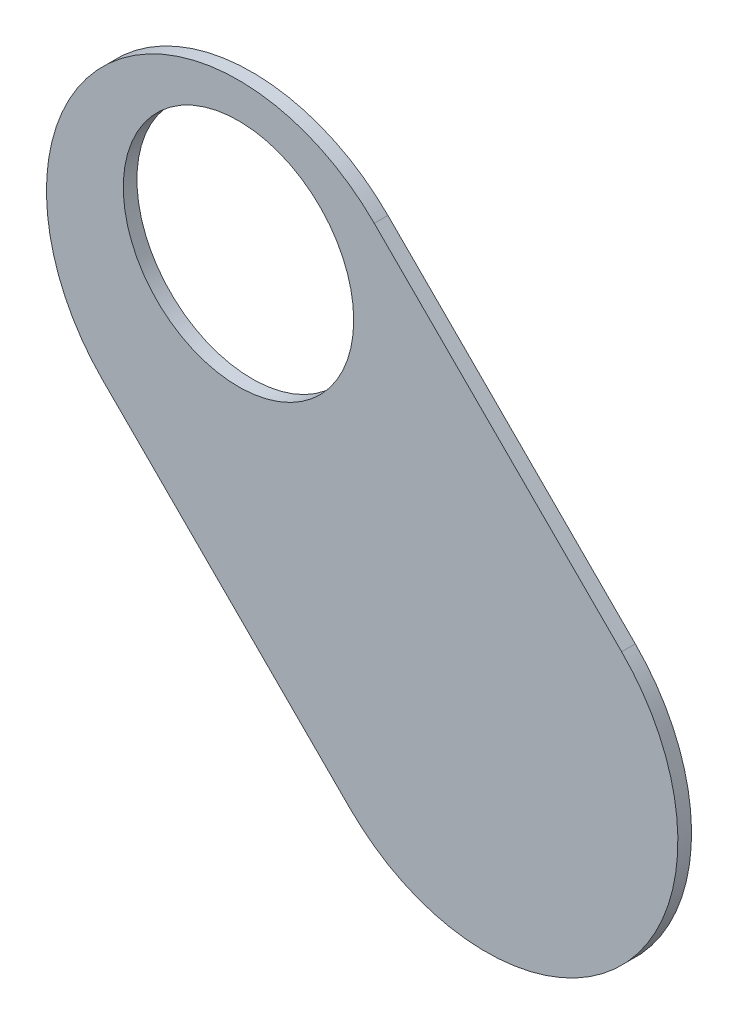
ISO-10303-21;
HEADER;
FILE_DESCRIPTION(('STEP AP214'),'2;1');
FILE_NAME('part.step','',(''),(''),'','','');
FILE_SCHEMA(('AUTOMOTIVE_DESIGN { 1 0 10303 214 1 1 1 1 }'));
ENDSEC;
DATA;
#1=APPLICATION_CONTEXT('core data for automotive mechanical design processes');
#2=APPLICATION_PROTOCOL_DEFINITION('international standard','automotive_design',2000,#1);
#3=PRODUCT_CONTEXT('',#1,'mechanical');
#4=PRODUCT('Part','Part','',(#3));
#5=PRODUCT_RELATED_PRODUCT_CATEGORY('part','',(#4));
#6=PRODUCT_DEFINITION_FORMATION('','',#4);
#7=PRODUCT_DEFINITION_CONTEXT('part definition',#1,'design');
#8=PRODUCT_DEFINITION('design','',#6,#7);
#9=PRODUCT_DEFINITION_SHAPE('','',#8);
#10=(LENGTH_UNIT() NAMED_UNIT(*) SI_UNIT(.MILLI.,.METRE.));
#11=(NAMED_UNIT(*) PLANE_ANGLE_UNIT() SI_UNIT($,.RADIAN.));
#12=(NAMED_UNIT(*) SI_UNIT($,.STERADIAN.) SOLID_ANGLE_UNIT());
#13=UNCERTAINTY_MEASURE_WITH_UNIT(LENGTH_MEASURE(1.E-05),#10,'distance_accuracy_value','');
#14=(GEOMETRIC_REPRESENTATION_CONTEXT(3) GLOBAL_UNCERTAINTY_ASSIGNED_CONTEXT((#13)) GLOBAL_UNIT_ASSIGNED_CONTEXT((#10,
#11,#12)) REPRESENTATION_CONTEXT('',''));
#15=CARTESIAN_POINT('',(0.,0.,0.));
#16=DIRECTION('',(0.,0.,1.));
#17=DIRECTION('',(1.,0.,0.));
#18=AXIS2_PLACEMENT_3D('',#15,#16,#17);
#19=CARTESIAN_POINT('',(80.50643284,95.53821888,0.));
#20=DIRECTION('',(0.707106781186548,0.707106781186548,0.));
#21=DIRECTION('',(0.707106781186548,-0.707106781186548,0.));
#22=AXIS2_PLACEMENT_3D('',#19,#20,#21);
#23=PLANE('',#22);
#24=DIRECTION('',(0.707106781186548,-0.707106781186548,0.));
#25=VECTOR('',#24,1.);
#26=CARTESIAN_POINT('',(80.50643284,95.53821888,0.03556));
#27=LINE('',#26,#25);
#28=CARTESIAN_POINT('',(80.50643284,95.53821888,0.03556));
#29=VERTEX_POINT('',#28);
#30=CARTESIAN_POINT('',(81.15046762,94.8941841,0.03556));
#31=VERTEX_POINT('',#30);
#32=EDGE_CURVE('E11',#29,#31,#27,.T.);
#33=ORIENTED_EDGE('',*,*,#32,.F.);
#34=DIRECTION('',(0.,0.,1.));
#35=VECTOR('',#34,1.);
#36=CARTESIAN_POINT('',(80.50643284,95.53821888,0.));
#37=LINE('',#36,#35);
#38=CARTESIAN_POINT('',(80.50643284,95.53821888,0.));
#39=VERTEX_POINT('',#38);
#40=EDGE_CURVE('E24',#39,#29,#37,.T.);
#41=ORIENTED_EDGE('',*,*,#40,.F.);
#42=DIRECTION('',(0.707106781186548,-0.707106781186548,0.));
#43=VECTOR('',#42,1.);
#44=CARTESIAN_POINT('',(80.50643284,95.53821888,0.));
#45=LINE('',#44,#43);
#46=CARTESIAN_POINT('',(81.15046762,94.8941841,0.));
#47=VERTEX_POINT('',#46);
#48=EDGE_CURVE('E96',#39,#47,#45,.T.);
#49=ORIENTED_EDGE('',*,*,#48,.T.);
#50=DIRECTION('',(0.,0.,1.));
#51=VECTOR('',#50,1.);
#52=CARTESIAN_POINT('',(81.15046762,94.8941841,0.));
#53=LINE('',#52,#51);
#54=EDGE_CURVE('E37',#47,#31,#53,.T.);
#55=ORIENTED_EDGE('',*,*,#54,.T.);
#56=EDGE_LOOP('',(#33,#41,#49,#55));
#57=FACE_BOUND('',#56,.T.);
#58=ADVANCED_FACE('F17',(#57),#23,.F.);
#59=CARTESIAN_POINT('',(80.8599856,95.89177164,0.));
#60=DIRECTION('',(0.,0.,-1.));
#61=DIRECTION('',(0.707106781186548,0.707106781186548,0.));
#62=AXIS2_PLACEMENT_3D('',#59,#60,#61);
#63=CYLINDRICAL_SURFACE('',#62,0.499999108206439);
#64=CARTESIAN_POINT('',(80.8599856,95.89177164,0.03556));
#65=DIRECTION('',(0.,0.,1.));
#66=DIRECTION('',(0.707106781186548,0.707106781186548,0.));
#67=AXIS2_PLACEMENT_3D('',#64,#65,#66);
#68=CIRCLE('',#67,0.499999108206439);
#69=CARTESIAN_POINT('',(81.21353836,96.2453244,0.03556));
#70=VERTEX_POINT('',#69);
#71=EDGE_CURVE('E92',#70,#29,#68,.T.);
#72=ORIENTED_EDGE('',*,*,#71,.F.);
#73=DIRECTION('',(0.,0.,1.));
#74=VECTOR('',#73,1.);
#75=CARTESIAN_POINT('',(81.21353836,96.2453244,0.));
#76=LINE('',#75,#74);
#77=CARTESIAN_POINT('',(81.21353836,96.2453244,0.));
#78=VERTEX_POINT('',#77);
#79=EDGE_CURVE('E90',#78,#70,#76,.T.);
#80=ORIENTED_EDGE('',*,*,#79,.F.);
#81=CARTESIAN_POINT('',(80.8599856,95.89177164,0.));
#82=DIRECTION('',(0.,0.,1.));
#83=DIRECTION('',(0.707106781186548,0.707106781186548,0.));
#84=AXIS2_PLACEMENT_3D('',#81,#82,#83);
#85=CIRCLE('',#84,0.499999108206439);
#86=EDGE_CURVE('E88',#78,#39,#85,.T.);
#87=ORIENTED_EDGE('',*,*,#86,.T.);
#88=ORIENTED_EDGE('',*,*,#40,.T.);
#89=EDGE_LOOP('',(#72,#80,#87,#88));
#90=FACE_BOUND('',#89,.T.);
#91=ADVANCED_FACE('F111',(#90),#63,.T.);
#92=CARTESIAN_POINT('',(81.50402038,95.24773686,0.));
#93=DIRECTION('',(0.,0.,-1.));
#94=DIRECTION('',(-0.707106781186548,-0.707106781186548,0.));
#95=AXIS2_PLACEMENT_3D('',#92,#93,#94);
#96=CYLINDRICAL_SURFACE('',#95,0.499999108206439);
#97=CARTESIAN_POINT('',(81.50402038,95.24773686,0.03556));
#98=DIRECTION('',(0.,0.,1.));
#99=DIRECTION('',(-0.707106781186548,-0.707106781186548,0.));
#100=AXIS2_PLACEMENT_3D('',#97,#98,#99);
#101=CIRCLE('',#100,0.499999108206439);
#102=CARTESIAN_POINT('',(81.85757314,95.60128962,0.03556));
#103=VERTEX_POINT('',#102);
#104=EDGE_CURVE('E85',#31,#103,#101,.T.);
#105=ORIENTED_EDGE('',*,*,#104,.F.);
#106=ORIENTED_EDGE('',*,*,#54,.F.);
#107=CARTESIAN_POINT('',(81.50402038,95.24773686,0.));
#108=DIRECTION('',(0.,0.,1.));
#109=DIRECTION('',(-0.707106781186548,-0.707106781186548,0.));
#110=AXIS2_PLACEMENT_3D('',#107,#108,#109);
#111=CIRCLE('',#110,0.499999108206439);
#112=CARTESIAN_POINT('',(81.85757314,95.60128962,0.));
#113=VERTEX_POINT('',#112);
#114=EDGE_CURVE('E82',#47,#113,#111,.T.);
#115=ORIENTED_EDGE('',*,*,#114,.T.);
#116=DIRECTION('',(0.,0.,1.));
#117=VECTOR('',#116,1.);
#118=CARTESIAN_POINT('',(81.85757314,95.60128962,0.));
#119=LINE('',#118,#117);
#120=EDGE_CURVE('E80',#113,#103,#119,.T.);
#121=ORIENTED_EDGE('',*,*,#120,.T.);
#122=EDGE_LOOP('',(#105,#106,#115,#121));
#123=FACE_BOUND('',#122,.T.);
#124=ADVANCED_FACE('F104',(#123),#96,.T.);
#125=CARTESIAN_POINT('',(81.85757314,95.60128962,0.));
#126=DIRECTION('',(-0.707106781186548,-0.707106781186548,0.));
#127=DIRECTION('',(-0.707106781186548,0.707106781186548,0.));
#128=AXIS2_PLACEMENT_3D('',#125,#126,#127);
#129=PLANE('',#128);
#130=DIRECTION('',(-0.707106781186548,0.707106781186548,0.));
#131=VECTOR('',#130,1.);
#132=CARTESIAN_POINT('',(81.85757314,95.60128962,0.03556));
#133=LINE('',#132,#131);
#134=EDGE_CURVE('E77',#103,#70,#133,.T.);
#135=ORIENTED_EDGE('',*,*,#134,.F.);
#136=ORIENTED_EDGE('',*,*,#120,.F.);
#137=DIRECTION('',(-0.707106781186548,0.707106781186548,0.));
#138=VECTOR('',#137,1.);
#139=CARTESIAN_POINT('',(81.85757314,95.60128962,0.));
#140=LINE('',#139,#138);
#141=EDGE_CURVE('E68',#113,#78,#140,.T.);
#142=ORIENTED_EDGE('',*,*,#141,.T.);
#143=ORIENTED_EDGE('',*,*,#79,.T.);
#144=EDGE_LOOP('',(#135,#136,#142,#143));
#145=FACE_BOUND('',#144,.T.);
#146=ADVANCED_FACE('F110',(#145),#129,.F.);
#147=CARTESIAN_POINT('',(80.8599856,96.0000112,0.));
#148=DIRECTION('',(0.,0.,-1.));
#149=DIRECTION('',(1.,0.,0.));
#150=AXIS2_PLACEMENT_3D('',#147,#148,#149);
#151=CYLINDRICAL_SURFACE('',#150,0.2999994);
#152=DIRECTION('',(0.,0.,1.));
#153=VECTOR('',#152,1.);
#154=CARTESIAN_POINT('',(81.159985,96.0000112,0.));
#155=LINE('',#154,#153);
#156=CARTESIAN_POINT('',(81.159985,96.0000112,0.));
#157=VERTEX_POINT('',#156);
#158=CARTESIAN_POINT('',(81.159985,96.0000112,0.03556));
#159=VERTEX_POINT('',#158);
#160=EDGE_CURVE('E62',#157,#159,#155,.T.);
#161=ORIENTED_EDGE('',*,*,#160,.T.);
#162=CARTESIAN_POINT('',(80.8599856,96.0000112,0.03556));
#163=DIRECTION('',(0.,0.,1.));
#164=DIRECTION('',(1.,0.,0.));
#165=AXIS2_PLACEMENT_3D('',#162,#163,#164);
#166=CIRCLE('',#165,0.2999994);
#167=EDGE_CURVE('E67',#159,#159,#166,.T.);
#168=ORIENTED_EDGE('',*,*,#167,.T.);
#169=ORIENTED_EDGE('',*,*,#160,.F.);
#170=CARTESIAN_POINT('',(80.8599856,96.0000112,0.));
#171=DIRECTION('',(0.,0.,1.));
#172=DIRECTION('',(1.,0.,0.));
#173=AXIS2_PLACEMENT_3D('',#170,#171,#172);
#174=CIRCLE('',#173,0.2999994);
#175=EDGE_CURVE('E65',#157,#157,#174,.T.);
#176=ORIENTED_EDGE('',*,*,#175,.F.);
#177=EDGE_LOOP('',(#161,#168,#169,#176));
#178=FACE_BOUND('',#177,.T.);
#179=ADVANCED_FACE('F64',(#178),#151,.F.);
#180=CARTESIAN_POINT('',(80.50643284,95.53821888,0.));
#181=DIRECTION('',(0.,0.,-1.));
#182=DIRECTION('',(-1.,0.,0.));
#183=AXIS2_PLACEMENT_3D('',#180,#181,#182);
#184=PLANE('',#183);
#185=ORIENTED_EDGE('',*,*,#48,.F.);
#186=ORIENTED_EDGE('',*,*,#86,.F.);
#187=ORIENTED_EDGE('',*,*,#141,.F.);
#188=ORIENTED_EDGE('',*,*,#114,.F.);
#189=EDGE_LOOP('',(#185,#186,#187,#188));
#190=FACE_BOUND('',#189,.T.);
#191=ORIENTED_EDGE('',*,*,#175,.T.);
#192=EDGE_LOOP('',(#191));
#193=FACE_BOUND('',#192,.T.);
#194=ADVANCED_FACE('F71',(#190,#193),#184,.T.);
#195=CARTESIAN_POINT('',(80.50643284,95.53821888,0.03556));
#196=DIRECTION('',(0.,0.,-1.));
#197=DIRECTION('',(-1.,0.,0.));
#198=AXIS2_PLACEMENT_3D('',#195,#196,#197);
#199=PLANE('',#198);
#200=ORIENTED_EDGE('',*,*,#134,.T.);
#201=ORIENTED_EDGE('',*,*,#71,.T.);
#202=ORIENTED_EDGE('',*,*,#32,.T.);
#203=ORIENTED_EDGE('',*,*,#104,.T.);
#204=EDGE_LOOP('',(#200,#201,#202,#203));
#205=FACE_BOUND('',#204,.T.);
#206=ORIENTED_EDGE('',*,*,#167,.F.);
#207=EDGE_LOOP('',(#206));
#208=FACE_BOUND('',#207,.T.);
#209=ADVANCED_FACE('F107',(#205,#208),#199,.F.);
#210=CLOSED_SHELL('',(#58,#91,#124,#146,#179,#194,#209));
#211=MANIFOLD_SOLID_BREP('B1',#210);
#212=ADVANCED_BREP_SHAPE_REPRESENTATION('',(#18,#211),#14);
#213=SHAPE_DEFINITION_REPRESENTATION(#9,#212);
ENDSEC;
END-ISO-10303-21;
